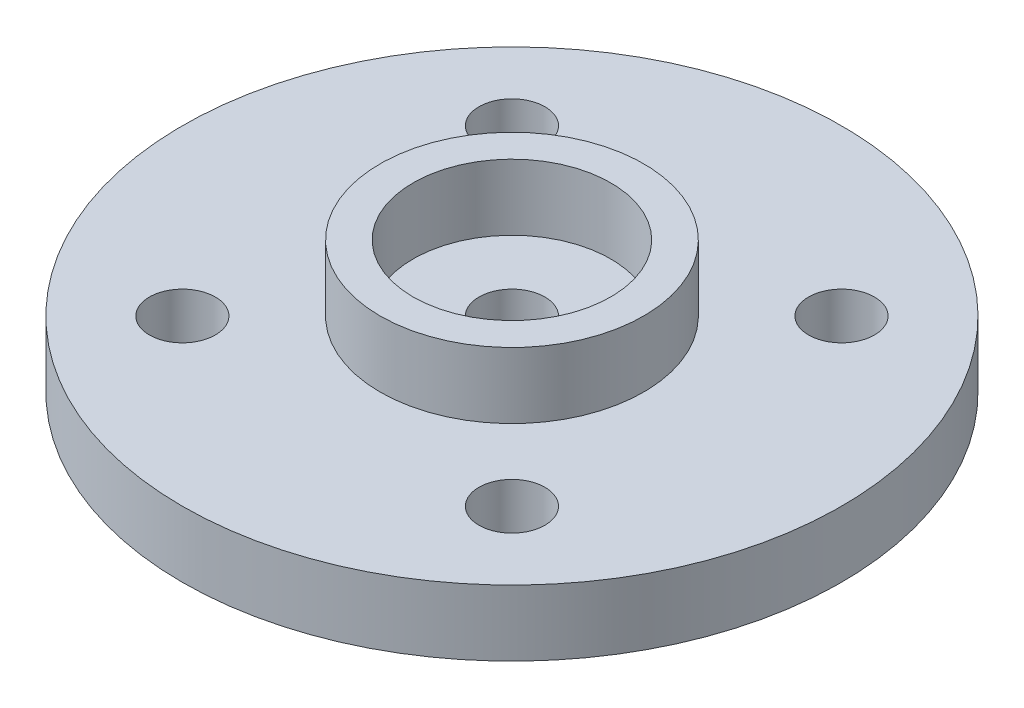
ISO-10303-21;
HEADER;
FILE_DESCRIPTION(('STEP AP214'),'2;1');
FILE_NAME('part.step','',(''),(''),'','','');
FILE_SCHEMA(('AUTOMOTIVE_DESIGN { 1 0 10303 214 1 1 1 1 }'));
ENDSEC;
DATA;
#1=APPLICATION_CONTEXT('core data for automotive mechanical design processes');
#2=APPLICATION_PROTOCOL_DEFINITION('international standard','automotive_design',2000,#1);
#3=PRODUCT_CONTEXT('',#1,'mechanical');
#4=PRODUCT('Part','Part','',(#3));
#5=PRODUCT_RELATED_PRODUCT_CATEGORY('part','',(#4));
#6=PRODUCT_DEFINITION_FORMATION('','',#4);
#7=PRODUCT_DEFINITION_CONTEXT('part definition',#1,'design');
#8=PRODUCT_DEFINITION('design','',#6,#7);
#9=PRODUCT_DEFINITION_SHAPE('','',#8);
#10=(LENGTH_UNIT() NAMED_UNIT(*) SI_UNIT(.MILLI.,.METRE.));
#11=(NAMED_UNIT(*) PLANE_ANGLE_UNIT() SI_UNIT($,.RADIAN.));
#12=(NAMED_UNIT(*) SI_UNIT($,.STERADIAN.) SOLID_ANGLE_UNIT());
#13=UNCERTAINTY_MEASURE_WITH_UNIT(LENGTH_MEASURE(1.E-05),#10,'distance_accuracy_value','');
#14=(GEOMETRIC_REPRESENTATION_CONTEXT(3) GLOBAL_UNCERTAINTY_ASSIGNED_CONTEXT((#13)) GLOBAL_UNIT_ASSIGNED_CONTEXT((#10,
#11,#12)) REPRESENTATION_CONTEXT('',''));
#15=CARTESIAN_POINT('',(0.,0.,0.));
#16=DIRECTION('',(0.,0.,1.));
#17=DIRECTION('',(1.,0.,0.));
#18=AXIS2_PLACEMENT_3D('',#15,#16,#17);
#19=CARTESIAN_POINT('',(0.,2.,0.));
#20=DIRECTION('',(0.,1.,0.));
#21=DIRECTION('',(0.,0.,1.));
#22=AXIS2_PLACEMENT_3D('',#19,#20,#21);
#23=PLANE('',#22);
#24=CARTESIAN_POINT('',(0.,2.,0.));
#25=DIRECTION('',(0.,1.,0.));
#26=DIRECTION('',(0.,0.,1.));
#27=AXIS2_PLACEMENT_3D('',#24,#25,#26);
#28=CIRCLE('',#27,1.);
#29=CARTESIAN_POINT('',(0.,2.,1.));
#30=VERTEX_POINT('',#29);
#31=EDGE_CURVE('E46',#30,#30,#28,.T.);
#32=ORIENTED_EDGE('',*,*,#31,.F.);
#33=EDGE_LOOP('',(#32));
#34=FACE_BOUND('',#33,.T.);
#35=CARTESIAN_POINT('',(0.,2.,0.));
#36=DIRECTION('',(0.,1.,0.));
#37=DIRECTION('',(0.,0.,1.));
#38=AXIS2_PLACEMENT_3D('',#35,#36,#37);
#39=CIRCLE('',#38,3.);
#40=CARTESIAN_POINT('',(0.,2.,3.));
#41=VERTEX_POINT('',#40);
#42=EDGE_CURVE('E10',#41,#41,#39,.F.);
#43=ORIENTED_EDGE('',*,*,#42,.F.);
#44=EDGE_LOOP('',(#43));
#45=FACE_BOUND('',#44,.T.);
#46=ADVANCED_FACE('F39',(#34,#45),#23,.T.);
#47=CARTESIAN_POINT('',(0.,2.,0.));
#48=DIRECTION('',(0.,-1.,0.));
#49=DIRECTION('',(0.,0.,-1.));
#50=AXIS2_PLACEMENT_3D('',#47,#48,#49);
#51=CYLINDRICAL_SURFACE('',#50,10.);
#52=CARTESIAN_POINT('',(0.,2.,0.));
#53=DIRECTION('',(0.,1.,0.));
#54=DIRECTION('',(0.,0.,1.));
#55=AXIS2_PLACEMENT_3D('',#52,#53,#54);
#56=CIRCLE('',#55,10.);
#57=CARTESIAN_POINT('',(0.,2.,10.));
#58=VERTEX_POINT('',#57);
#59=EDGE_CURVE('E50',#58,#58,#56,.T.);
#60=ORIENTED_EDGE('',*,*,#59,.F.);
#61=EDGE_LOOP('',(#60));
#62=FACE_BOUND('',#61,.T.);
#63=CARTESIAN_POINT('',(0.,0.,0.));
#64=DIRECTION('',(0.,1.,0.));
#65=DIRECTION('',(0.,0.,1.));
#66=AXIS2_PLACEMENT_3D('',#63,#64,#65);
#67=CIRCLE('',#66,10.);
#68=CARTESIAN_POINT('',(0.,0.,10.));
#69=VERTEX_POINT('',#68);
#70=EDGE_CURVE('E72',#69,#69,#67,.T.);
#71=ORIENTED_EDGE('',*,*,#70,.T.);
#72=EDGE_LOOP('',(#71));
#73=FACE_BOUND('',#72,.T.);
#74=ADVANCED_FACE('F107',(#62,#73),#51,.T.);
#75=CARTESIAN_POINT('',(-5.,2.,-5.));
#76=DIRECTION('',(0.,-1.,0.));
#77=DIRECTION('',(0.,0.,-1.));
#78=AXIS2_PLACEMENT_3D('',#75,#76,#77);
#79=CYLINDRICAL_SURFACE('',#78,1.);
#80=CARTESIAN_POINT('',(-5.,2.,-5.));
#81=DIRECTION('',(0.,1.,0.));
#82=DIRECTION('',(0.,0.,1.));
#83=AXIS2_PLACEMENT_3D('',#80,#81,#82);
#84=CIRCLE('',#83,1.);
#85=CARTESIAN_POINT('',(-5.,2.,-4.));
#86=VERTEX_POINT('',#85);
#87=EDGE_CURVE('E55',#86,#86,#84,.T.);
#88=ORIENTED_EDGE('',*,*,#87,.T.);
#89=EDGE_LOOP('',(#88));
#90=FACE_BOUND('',#89,.T.);
#91=CARTESIAN_POINT('',(-5.,0.,-5.));
#92=DIRECTION('',(0.,1.,0.));
#93=DIRECTION('',(0.,0.,1.));
#94=AXIS2_PLACEMENT_3D('',#91,#92,#93);
#95=CIRCLE('',#94,1.);
#96=CARTESIAN_POINT('',(-5.,0.,-4.));
#97=VERTEX_POINT('',#96);
#98=EDGE_CURVE('E69',#97,#97,#95,.T.);
#99=ORIENTED_EDGE('',*,*,#98,.F.);
#100=EDGE_LOOP('',(#99));
#101=FACE_BOUND('',#100,.T.);
#102=ADVANCED_FACE('F95',(#90,#101),#79,.F.);
#103=CARTESIAN_POINT('',(5.,2.,-5.00000000000028));
#104=DIRECTION('',(0.,-1.,0.));
#105=DIRECTION('',(0.,0.,-1.));
#106=AXIS2_PLACEMENT_3D('',#103,#104,#105);
#107=CYLINDRICAL_SURFACE('',#106,1.00000000000029);
#108=CARTESIAN_POINT('',(5.,2.,-5.00000000000028));
#109=DIRECTION('',(0.,1.,0.));
#110=DIRECTION('',(0.,0.,1.));
#111=AXIS2_PLACEMENT_3D('',#108,#109,#110);
#112=CIRCLE('',#111,1.00000000000029);
#113=CARTESIAN_POINT('',(5.,2.,-3.99999999999999));
#114=VERTEX_POINT('',#113);
#115=EDGE_CURVE('E85',#114,#114,#112,.T.);
#116=ORIENTED_EDGE('',*,*,#115,.T.);
#117=EDGE_LOOP('',(#116));
#118=FACE_BOUND('',#117,.T.);
#119=CARTESIAN_POINT('',(5.,0.,-5.00000000000028));
#120=DIRECTION('',(0.,1.,0.));
#121=DIRECTION('',(0.,0.,1.));
#122=AXIS2_PLACEMENT_3D('',#119,#120,#121);
#123=CIRCLE('',#122,1.00000000000029);
#124=CARTESIAN_POINT('',(5.,0.,-3.99999999999999));
#125=VERTEX_POINT('',#124);
#126=EDGE_CURVE('E66',#125,#125,#123,.T.);
#127=ORIENTED_EDGE('',*,*,#126,.F.);
#128=EDGE_LOOP('',(#127));
#129=FACE_BOUND('',#128,.T.);
#130=ADVANCED_FACE('F156',(#118,#129),#107,.F.);
#131=CARTESIAN_POINT('',(5.00000000000028,2.,4.99999999999972));
#132=DIRECTION('',(0.,-1.,0.));
#133=DIRECTION('',(0.,0.,-1.));
#134=AXIS2_PLACEMENT_3D('',#131,#132,#133);
#135=CYLINDRICAL_SURFACE('',#134,1.0000000000004);
#136=CARTESIAN_POINT('',(5.00000000000028,2.,4.99999999999972));
#137=DIRECTION('',(0.,1.,0.));
#138=DIRECTION('',(0.,0.,1.));
#139=AXIS2_PLACEMENT_3D('',#136,#137,#138);
#140=CIRCLE('',#139,1.0000000000004);
#141=CARTESIAN_POINT('',(5.00000000000028,2.,6.00000000000011));
#142=VERTEX_POINT('',#141);
#143=EDGE_CURVE('E80',#142,#142,#140,.T.);
#144=ORIENTED_EDGE('',*,*,#143,.T.);
#145=EDGE_LOOP('',(#144));
#146=FACE_BOUND('',#145,.T.);
#147=CARTESIAN_POINT('',(5.00000000000028,0.,4.99999999999972));
#148=DIRECTION('',(0.,1.,0.));
#149=DIRECTION('',(0.,0.,1.));
#150=AXIS2_PLACEMENT_3D('',#147,#148,#149);
#151=CIRCLE('',#150,1.0000000000004);
#152=CARTESIAN_POINT('',(5.00000000000028,0.,6.00000000000011));
#153=VERTEX_POINT('',#152);
#154=EDGE_CURVE('E62',#153,#153,#151,.T.);
#155=ORIENTED_EDGE('',*,*,#154,.F.);
#156=EDGE_LOOP('',(#155));
#157=FACE_BOUND('',#156,.T.);
#158=ADVANCED_FACE('F159',(#146,#157),#135,.F.);
#159=CARTESIAN_POINT('',(-4.99999999999972,2.,5.));
#160=DIRECTION('',(0.,-1.,0.));
#161=DIRECTION('',(0.,0.,-1.));
#162=AXIS2_PLACEMENT_3D('',#159,#160,#161);
#163=CYLINDRICAL_SURFACE('',#162,1.00000000000015);
#164=CARTESIAN_POINT('',(-4.99999999999972,2.,5.));
#165=DIRECTION('',(0.,1.,0.));
#166=DIRECTION('',(0.,0.,1.));
#167=AXIS2_PLACEMENT_3D('',#164,#165,#166);
#168=CIRCLE('',#167,1.00000000000015);
#169=CARTESIAN_POINT('',(-4.99999999999972,2.,6.00000000000015));
#170=VERTEX_POINT('',#169);
#171=EDGE_CURVE('E76',#170,#170,#168,.T.);
#172=ORIENTED_EDGE('',*,*,#171,.T.);
#173=EDGE_LOOP('',(#172));
#174=FACE_BOUND('',#173,.T.);
#175=CARTESIAN_POINT('',(-4.99999999999972,0.,5.));
#176=DIRECTION('',(0.,1.,0.));
#177=DIRECTION('',(0.,0.,1.));
#178=AXIS2_PLACEMENT_3D('',#175,#176,#177);
#179=CIRCLE('',#178,1.00000000000015);
#180=CARTESIAN_POINT('',(-4.99999999999972,0.,6.00000000000015));
#181=VERTEX_POINT('',#180);
#182=EDGE_CURVE('E59',#181,#181,#179,.T.);
#183=ORIENTED_EDGE('',*,*,#182,.F.);
#184=EDGE_LOOP('',(#183));
#185=FACE_BOUND('',#184,.T.);
#186=ADVANCED_FACE('F41',(#174,#185),#163,.F.);
#187=CARTESIAN_POINT('',(0.,2.,0.));
#188=DIRECTION('',(0.,-1.,0.));
#189=DIRECTION('',(0.,0.,-1.));
#190=AXIS2_PLACEMENT_3D('',#187,#188,#189);
#191=CYLINDRICAL_SURFACE('',#190,1.);
#192=ORIENTED_EDGE('',*,*,#31,.T.);
#193=EDGE_LOOP('',(#192));
#194=FACE_BOUND('',#193,.T.);
#195=CARTESIAN_POINT('',(0.,0.,0.));
#196=DIRECTION('',(0.,1.,0.));
#197=DIRECTION('',(0.,0.,1.));
#198=AXIS2_PLACEMENT_3D('',#195,#196,#197);
#199=CIRCLE('',#198,1.);
#200=CARTESIAN_POINT('',(0.,0.,1.));
#201=VERTEX_POINT('',#200);
#202=EDGE_CURVE('E74',#201,#201,#199,.T.);
#203=ORIENTED_EDGE('',*,*,#202,.F.);
#204=EDGE_LOOP('',(#203));
#205=FACE_BOUND('',#204,.T.);
#206=ADVANCED_FACE('F102',(#194,#205),#191,.F.);
#207=CARTESIAN_POINT('',(0.,2.,0.));
#208=DIRECTION('',(0.,1.,0.));
#209=DIRECTION('',(0.,0.,1.));
#210=AXIS2_PLACEMENT_3D('',#207,#208,#209);
#211=CIRCLE('',#210,4.);
#212=CARTESIAN_POINT('',(0.,2.,4.));
#213=VERTEX_POINT('',#212);
#214=EDGE_CURVE('E88',#213,#213,#211,.T.);
#215=ORIENTED_EDGE('',*,*,#214,.F.);
#216=EDGE_LOOP('',(#215));
#217=FACE_BOUND('',#216,.T.);
#218=ORIENTED_EDGE('',*,*,#171,.F.);
#219=EDGE_LOOP('',(#218));
#220=FACE_BOUND('',#219,.T.);
#221=ORIENTED_EDGE('',*,*,#143,.F.);
#222=EDGE_LOOP('',(#221));
#223=FACE_BOUND('',#222,.T.);
#224=ORIENTED_EDGE('',*,*,#115,.F.);
#225=EDGE_LOOP('',(#224));
#226=FACE_BOUND('',#225,.T.);
#227=ORIENTED_EDGE('',*,*,#87,.F.);
#228=EDGE_LOOP('',(#227));
#229=FACE_BOUND('',#228,.T.);
#230=ORIENTED_EDGE('',*,*,#59,.T.);
#231=EDGE_LOOP('',(#230));
#232=FACE_BOUND('',#231,.T.);
#233=ADVANCED_FACE('F98',(#217,#220,#223,#226,#229,#232),#23,.T.);
#234=CARTESIAN_POINT('',(0.,0.,0.));
#235=DIRECTION('',(0.,1.,0.));
#236=DIRECTION('',(0.,0.,1.));
#237=AXIS2_PLACEMENT_3D('',#234,#235,#236);
#238=PLANE('',#237);
#239=ORIENTED_EDGE('',*,*,#182,.T.);
#240=EDGE_LOOP('',(#239));
#241=FACE_BOUND('',#240,.T.);
#242=ORIENTED_EDGE('',*,*,#154,.T.);
#243=EDGE_LOOP('',(#242));
#244=FACE_BOUND('',#243,.T.);
#245=ORIENTED_EDGE('',*,*,#126,.T.);
#246=EDGE_LOOP('',(#245));
#247=FACE_BOUND('',#246,.T.);
#248=ORIENTED_EDGE('',*,*,#98,.T.);
#249=EDGE_LOOP('',(#248));
#250=FACE_BOUND('',#249,.T.);
#251=ORIENTED_EDGE('',*,*,#70,.F.);
#252=EDGE_LOOP('',(#251));
#253=FACE_BOUND('',#252,.T.);
#254=ORIENTED_EDGE('',*,*,#202,.T.);
#255=EDGE_LOOP('',(#254));
#256=FACE_BOUND('',#255,.T.);
#257=ADVANCED_FACE('F101',(#241,#244,#247,#250,#253,#256),#238,.F.);
#258=CARTESIAN_POINT('',(0.,4.,0.));
#259=DIRECTION('',(0.,-1.,0.));
#260=DIRECTION('',(0.,0.,-1.));
#261=AXIS2_PLACEMENT_3D('',#258,#259,#260);
#262=CYLINDRICAL_SURFACE('',#261,3.);
#263=CARTESIAN_POINT('',(0.,4.,0.));
#264=DIRECTION('',(0.,1.,0.));
#265=DIRECTION('',(0.,0.,1.));
#266=AXIS2_PLACEMENT_3D('',#263,#264,#265);
#267=CIRCLE('',#266,3.);
#268=CARTESIAN_POINT('',(0.,4.,3.));
#269=VERTEX_POINT('',#268);
#270=EDGE_CURVE('E143',#269,#269,#267,.T.);
#271=ORIENTED_EDGE('',*,*,#270,.T.);
#272=EDGE_LOOP('',(#271));
#273=FACE_BOUND('',#272,.T.);
#274=ORIENTED_EDGE('',*,*,#42,.T.);
#275=EDGE_LOOP('',(#274));
#276=FACE_BOUND('',#275,.T.);
#277=ADVANCED_FACE('F114',(#273,#276),#262,.F.);
#278=CARTESIAN_POINT('',(0.,4.,0.));
#279=DIRECTION('',(0.,-1.,0.));
#280=DIRECTION('',(0.,0.,-1.));
#281=AXIS2_PLACEMENT_3D('',#278,#279,#280);
#282=CYLINDRICAL_SURFACE('',#281,4.);
#283=CARTESIAN_POINT('',(0.,4.,0.));
#284=DIRECTION('',(0.,1.,0.));
#285=DIRECTION('',(0.,0.,1.));
#286=AXIS2_PLACEMENT_3D('',#283,#284,#285);
#287=CIRCLE('',#286,4.);
#288=CARTESIAN_POINT('',(0.,4.,4.));
#289=VERTEX_POINT('',#288);
#290=EDGE_CURVE('E63',#289,#289,#287,.T.);
#291=ORIENTED_EDGE('',*,*,#290,.F.);
#292=EDGE_LOOP('',(#291));
#293=FACE_BOUND('',#292,.T.);
#294=ORIENTED_EDGE('',*,*,#214,.T.);
#295=EDGE_LOOP('',(#294));
#296=FACE_BOUND('',#295,.T.);
#297=ADVANCED_FACE('F122',(#293,#296),#282,.T.);
#298=CARTESIAN_POINT('',(0.,4.,0.));
#299=DIRECTION('',(0.,1.,0.));
#300=DIRECTION('',(0.,0.,1.));
#301=AXIS2_PLACEMENT_3D('',#298,#299,#300);
#302=PLANE('',#301);
#303=ORIENTED_EDGE('',*,*,#270,.F.);
#304=EDGE_LOOP('',(#303));
#305=FACE_BOUND('',#304,.T.);
#306=ORIENTED_EDGE('',*,*,#290,.T.);
#307=EDGE_LOOP('',(#306));
#308=FACE_BOUND('',#307,.T.);
#309=ADVANCED_FACE('F134',(#305,#308),#302,.T.);
#310=CLOSED_SHELL('',(#46,#74,#102,#130,#158,#186,#206,#233,#257,#277,#297,#309));
#311=MANIFOLD_SOLID_BREP('B2',#310);
#312=ADVANCED_BREP_SHAPE_REPRESENTATION('',(#18,#311),#14);
#313=SHAPE_DEFINITION_REPRESENTATION(#9,#312);
ENDSEC;
END-ISO-10303-21;
